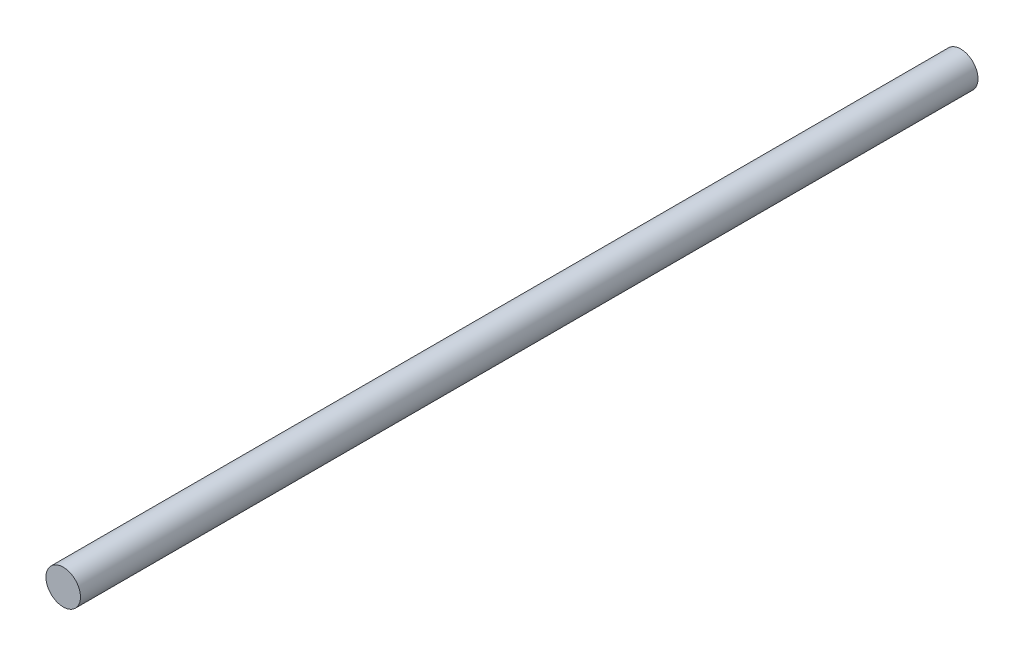
ISO-10303-21;
HEADER;
FILE_DESCRIPTION(('STEP AP214'),'2;1');
FILE_NAME('part.step','',(''),(''),'','','');
FILE_SCHEMA(('AUTOMOTIVE_DESIGN { 1 0 10303 214 1 1 1 1 }'));
ENDSEC;
DATA;
#1=APPLICATION_CONTEXT('core data for automotive mechanical design processes');
#2=APPLICATION_PROTOCOL_DEFINITION('international standard','automotive_design',2000,#1);
#3=PRODUCT_CONTEXT('',#1,'mechanical');
#4=PRODUCT('Part','Part','',(#3));
#5=PRODUCT_RELATED_PRODUCT_CATEGORY('part','',(#4));
#6=PRODUCT_DEFINITION_FORMATION('','',#4);
#7=PRODUCT_DEFINITION_CONTEXT('part definition',#1,'design');
#8=PRODUCT_DEFINITION('design','',#6,#7);
#9=PRODUCT_DEFINITION_SHAPE('','',#8);
#10=(LENGTH_UNIT() NAMED_UNIT(*) SI_UNIT(.MILLI.,.METRE.));
#11=(NAMED_UNIT(*) PLANE_ANGLE_UNIT() SI_UNIT($,.RADIAN.));
#12=(NAMED_UNIT(*) SI_UNIT($,.STERADIAN.) SOLID_ANGLE_UNIT());
#13=UNCERTAINTY_MEASURE_WITH_UNIT(LENGTH_MEASURE(1.E-05),#10,'distance_accuracy_value','');
#14=(GEOMETRIC_REPRESENTATION_CONTEXT(3) GLOBAL_UNCERTAINTY_ASSIGNED_CONTEXT((#13)) GLOBAL_UNIT_ASSIGNED_CONTEXT((#10,
#11,#12)) REPRESENTATION_CONTEXT('',''));
#15=CARTESIAN_POINT('',(0.,0.,0.));
#16=DIRECTION('',(0.,0.,1.));
#17=DIRECTION('',(1.,0.,0.));
#18=AXIS2_PLACEMENT_3D('',#15,#16,#17);
#19=CARTESIAN_POINT('',(0.,0.,260.));
#20=DIRECTION('',(0.,0.,-1.));
#21=DIRECTION('',(-1.,0.,0.));
#22=AXIS2_PLACEMENT_3D('',#19,#20,#21);
#23=CYLINDRICAL_SURFACE('',#22,5.);
#24=CARTESIAN_POINT('',(0.,0.,260.));
#25=DIRECTION('',(0.,0.,1.));
#26=DIRECTION('',(1.,0.,0.));
#27=AXIS2_PLACEMENT_3D('',#24,#25,#26);
#28=CIRCLE('',#27,5.);
#29=CARTESIAN_POINT('',(5.,0.,260.));
#30=VERTEX_POINT('',#29);
#31=EDGE_CURVE('E10',#30,#30,#28,.T.);
#32=ORIENTED_EDGE('',*,*,#31,.F.);
#33=EDGE_LOOP('',(#32));
#34=FACE_BOUND('',#33,.T.);
#35=CARTESIAN_POINT('',(0.,0.,0.));
#36=DIRECTION('',(0.,0.,1.));
#37=DIRECTION('',(1.,0.,0.));
#38=AXIS2_PLACEMENT_3D('',#35,#36,#37);
#39=CIRCLE('',#38,5.);
#40=CARTESIAN_POINT('',(5.,0.,0.));
#41=VERTEX_POINT('',#40);
#42=EDGE_CURVE('E36',#41,#41,#39,.T.);
#43=ORIENTED_EDGE('',*,*,#42,.T.);
#44=EDGE_LOOP('',(#43));
#45=FACE_BOUND('',#44,.T.);
#46=ADVANCED_FACE('F33',(#34,#45),#23,.T.);
#47=CARTESIAN_POINT('',(0.,0.,260.));
#48=DIRECTION('',(0.,0.,1.));
#49=DIRECTION('',(1.,0.,0.));
#50=AXIS2_PLACEMENT_3D('',#47,#48,#49);
#51=PLANE('',#50);
#52=ORIENTED_EDGE('',*,*,#31,.T.);
#53=EDGE_LOOP('',(#52));
#54=FACE_BOUND('',#53,.T.);
#55=ADVANCED_FACE('F48',(#54),#51,.T.);
#56=CARTESIAN_POINT('',(0.,0.,0.));
#57=DIRECTION('',(0.,0.,1.));
#58=DIRECTION('',(1.,0.,0.));
#59=AXIS2_PLACEMENT_3D('',#56,#57,#58);
#60=PLANE('',#59);
#61=ORIENTED_EDGE('',*,*,#42,.F.);
#62=EDGE_LOOP('',(#61));
#63=FACE_BOUND('',#62,.T.);
#64=ADVANCED_FACE('F46',(#63),#60,.F.);
#65=CLOSED_SHELL('',(#46,#55,#64));
#66=MANIFOLD_SOLID_BREP('B2',#65);
#67=ADVANCED_BREP_SHAPE_REPRESENTATION('',(#18,#66),#14);
#68=SHAPE_DEFINITION_REPRESENTATION(#9,#67);
ENDSEC;
END-ISO-10303-21;
